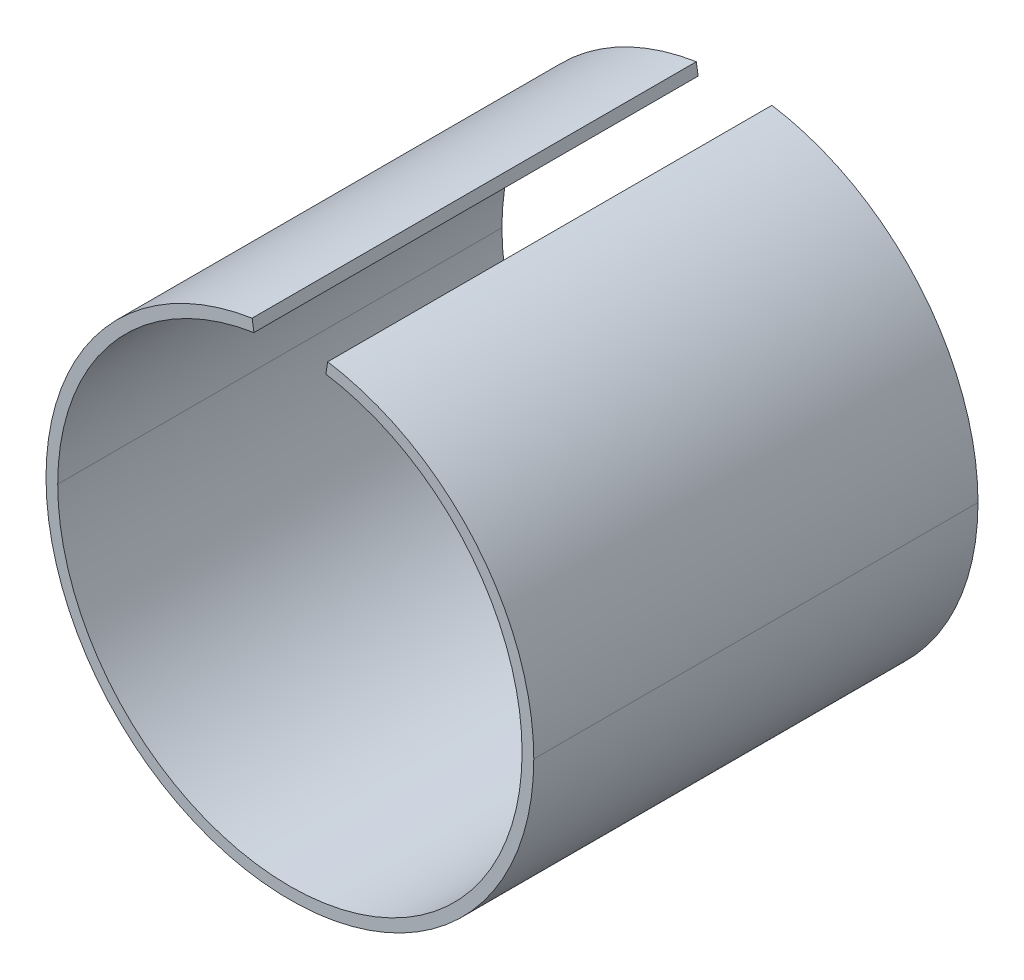
ISO-10303-21;
HEADER;
FILE_DESCRIPTION(('STEP AP214'),'2;1');
FILE_NAME('part.step','',(''),(''),'','','');
FILE_SCHEMA(('AUTOMOTIVE_DESIGN { 1 0 10303 214 1 1 1 1 }'));
ENDSEC;
DATA;
#1=APPLICATION_CONTEXT('core data for automotive mechanical design processes');
#2=APPLICATION_PROTOCOL_DEFINITION('international standard','automotive_design',2000,#1);
#3=PRODUCT_CONTEXT('',#1,'mechanical');
#4=PRODUCT('Part','Part','',(#3));
#5=PRODUCT_RELATED_PRODUCT_CATEGORY('part','',(#4));
#6=PRODUCT_DEFINITION_FORMATION('','',#4);
#7=PRODUCT_DEFINITION_CONTEXT('part definition',#1,'design');
#8=PRODUCT_DEFINITION('design','',#6,#7);
#9=PRODUCT_DEFINITION_SHAPE('','',#8);
#10=(LENGTH_UNIT() NAMED_UNIT(*) SI_UNIT(.MILLI.,.METRE.));
#11=(NAMED_UNIT(*) PLANE_ANGLE_UNIT() SI_UNIT($,.RADIAN.));
#12=(NAMED_UNIT(*) SI_UNIT($,.STERADIAN.) SOLID_ANGLE_UNIT());
#13=UNCERTAINTY_MEASURE_WITH_UNIT(LENGTH_MEASURE(1.E-05),#10,'distance_accuracy_value','');
#14=(GEOMETRIC_REPRESENTATION_CONTEXT(3) GLOBAL_UNCERTAINTY_ASSIGNED_CONTEXT((#13)) GLOBAL_UNIT_ASSIGNED_CONTEXT((#10,
#11,#12)) REPRESENTATION_CONTEXT('',''));
#15=CARTESIAN_POINT('',(0.,0.,0.));
#16=DIRECTION('',(0.,0.,1.));
#17=DIRECTION('',(1.,0.,0.));
#18=AXIS2_PLACEMENT_3D('',#15,#16,#17);
#19=CARTESIAN_POINT('',(0.,0.,34.15));
#20=DIRECTION('',(0.,0.,-1.));
#21=DIRECTION('',(-1.,0.,0.));
#22=AXIS2_PLACEMENT_3D('',#19,#20,#21);
#23=CYLINDRICAL_SURFACE('',#22,17.85);
#24=CARTESIAN_POINT('',(0.,0.,34.15));
#25=DIRECTION('',(0.,0.,1.));
#26=DIRECTION('',(1.,0.,0.));
#27=AXIS2_PLACEMENT_3D('',#24,#25,#26);
#28=CIRCLE('',#27,17.85);
#29=CARTESIAN_POINT('',(-17.85,0.,34.15));
#30=VERTEX_POINT('',#29);
#31=CARTESIAN_POINT('',(17.85,0.,34.15));
#32=VERTEX_POINT('',#31);
#33=EDGE_CURVE('E11',#30,#32,#28,.T.);
#34=ORIENTED_EDGE('',*,*,#33,.T.);
#35=DIRECTION('',(0.,0.,-1.));
#36=VECTOR('',#35,1.);
#37=CARTESIAN_POINT('',(17.85,0.,34.15));
#38=LINE('',#37,#36);
#39=CARTESIAN_POINT('',(17.85,0.,0.));
#40=VERTEX_POINT('',#39);
#41=EDGE_CURVE('E26',#32,#40,#38,.T.);
#42=ORIENTED_EDGE('',*,*,#41,.T.);
#43=CARTESIAN_POINT('',(0.,0.,0.));
#44=DIRECTION('',(0.,0.,1.));
#45=DIRECTION('',(1.,0.,0.));
#46=AXIS2_PLACEMENT_3D('',#43,#44,#45);
#47=CIRCLE('',#46,17.85);
#48=CARTESIAN_POINT('',(-17.85,0.,0.));
#49=VERTEX_POINT('',#48);
#50=EDGE_CURVE('E134',#49,#40,#47,.T.);
#51=ORIENTED_EDGE('',*,*,#50,.F.);
#52=DIRECTION('',(0.,0.,-1.));
#53=VECTOR('',#52,1.);
#54=CARTESIAN_POINT('',(-17.85,0.,34.15));
#55=LINE('',#54,#53);
#56=EDGE_CURVE('E158',#30,#49,#55,.T.);
#57=ORIENTED_EDGE('',*,*,#56,.F.);
#58=EDGE_LOOP('',(#34,#42,#51,#57));
#59=FACE_BOUND('',#58,.T.);
#60=ADVANCED_FACE('F16',(#59),#23,.F.);
#61=CARTESIAN_POINT('',(0.,0.,34.15));
#62=DIRECTION('',(0.,0.,-1.));
#63=DIRECTION('',(-1.,0.,0.));
#64=AXIS2_PLACEMENT_3D('',#61,#62,#63);
#65=CYLINDRICAL_SURFACE('',#64,17.85);
#66=CARTESIAN_POINT('',(0.,0.,34.15));
#67=DIRECTION('',(0.,0.,1.));
#68=DIRECTION('',(1.,0.,0.));
#69=AXIS2_PLACEMENT_3D('',#66,#67,#68);
#70=CIRCLE('',#69,17.85);
#71=CARTESIAN_POINT('',(-2.765,17.634547768514,34.15));
#72=VERTEX_POINT('',#71);
#73=EDGE_CURVE('E196',#72,#30,#70,.T.);
#74=ORIENTED_EDGE('',*,*,#73,.T.);
#75=ORIENTED_EDGE('',*,*,#56,.T.);
#76=CARTESIAN_POINT('',(0.,0.,0.));
#77=DIRECTION('',(0.,0.,1.));
#78=DIRECTION('',(1.,0.,0.));
#79=AXIS2_PLACEMENT_3D('',#76,#77,#78);
#80=CIRCLE('',#79,17.85);
#81=CARTESIAN_POINT('',(-2.765,17.634547768514,0.));
#82=VERTEX_POINT('',#81);
#83=EDGE_CURVE('E93',#82,#49,#80,.T.);
#84=ORIENTED_EDGE('',*,*,#83,.F.);
#85=DIRECTION('',(0.,0.,-1.));
#86=VECTOR('',#85,1.);
#87=CARTESIAN_POINT('',(-2.765,17.634547768514,34.15));
#88=LINE('',#87,#86);
#89=EDGE_CURVE('E84',#72,#82,#88,.T.);
#90=ORIENTED_EDGE('',*,*,#89,.F.);
#91=EDGE_LOOP('',(#74,#75,#84,#90));
#92=FACE_BOUND('',#91,.T.);
#93=ADVANCED_FACE('F283',(#92),#65,.F.);
#94=CARTESIAN_POINT('',(0.,0.,34.15));
#95=DIRECTION('',(0.,0.,-1.));
#96=DIRECTION('',(-1.,0.,0.));
#97=AXIS2_PLACEMENT_3D('',#94,#95,#96);
#98=CYLINDRICAL_SURFACE('',#97,18.75);
#99=CARTESIAN_POINT('',(0.,0.,34.15));
#100=DIRECTION('',(0.,0.,1.));
#101=DIRECTION('',(1.,0.,0.));
#102=AXIS2_PLACEMENT_3D('',#99,#100,#101);
#103=CIRCLE('',#102,18.75);
#104=CARTESIAN_POINT('',(18.75,0.,34.15));
#105=VERTEX_POINT('',#104);
#106=CARTESIAN_POINT('',(2.90441176470588,18.5236846307919,34.15));
#107=VERTEX_POINT('',#106);
#108=EDGE_CURVE('E150',#105,#107,#103,.T.);
#109=ORIENTED_EDGE('',*,*,#108,.F.);
#110=DIRECTION('',(0.,0.,-1.));
#111=VECTOR('',#110,1.);
#112=CARTESIAN_POINT('',(18.75,0.,34.15));
#113=LINE('',#112,#111);
#114=CARTESIAN_POINT('',(18.75,0.,0.));
#115=VERTEX_POINT('',#114);
#116=EDGE_CURVE('E154',#105,#115,#113,.T.);
#117=ORIENTED_EDGE('',*,*,#116,.T.);
#118=CARTESIAN_POINT('',(0.,0.,0.));
#119=DIRECTION('',(0.,0.,1.));
#120=DIRECTION('',(1.,0.,0.));
#121=AXIS2_PLACEMENT_3D('',#118,#119,#120);
#122=CIRCLE('',#121,18.75);
#123=CARTESIAN_POINT('',(2.90441176470588,18.5236846307919,0.));
#124=VERTEX_POINT('',#123);
#125=EDGE_CURVE('E159',#115,#124,#122,.T.);
#126=ORIENTED_EDGE('',*,*,#125,.T.);
#127=DIRECTION('',(0.,0.,-1.));
#128=VECTOR('',#127,1.);
#129=CARTESIAN_POINT('',(2.90441176470588,18.5236846307919,34.15));
#130=LINE('',#129,#128);
#131=EDGE_CURVE('E121',#107,#124,#130,.T.);
#132=ORIENTED_EDGE('',*,*,#131,.F.);
#133=EDGE_LOOP('',(#109,#117,#126,#132));
#134=FACE_BOUND('',#133,.T.);
#135=ADVANCED_FACE('F287',(#134),#98,.T.);
#136=CARTESIAN_POINT('',(0.,0.,34.15));
#137=DIRECTION('',(0.,0.,-1.));
#138=DIRECTION('',(-1.,0.,0.));
#139=AXIS2_PLACEMENT_3D('',#136,#137,#138);
#140=CYLINDRICAL_SURFACE('',#139,18.75);
#141=ORIENTED_EDGE('',*,*,#116,.F.);
#142=CARTESIAN_POINT('',(0.,0.,34.15));
#143=DIRECTION('',(0.,0.,1.));
#144=DIRECTION('',(1.,0.,0.));
#145=AXIS2_PLACEMENT_3D('',#142,#143,#144);
#146=CIRCLE('',#145,18.75);
#147=CARTESIAN_POINT('',(-18.75,0.,34.15));
#148=VERTEX_POINT('',#147);
#149=EDGE_CURVE('E153',#148,#105,#146,.T.);
#150=ORIENTED_EDGE('',*,*,#149,.F.);
#151=DIRECTION('',(0.,0.,-1.));
#152=VECTOR('',#151,1.);
#153=CARTESIAN_POINT('',(-18.75,0.,34.15));
#154=LINE('',#153,#152);
#155=CARTESIAN_POINT('',(-18.75,0.,0.));
#156=VERTEX_POINT('',#155);
#157=EDGE_CURVE('E174',#148,#156,#154,.T.);
#158=ORIENTED_EDGE('',*,*,#157,.T.);
#159=CARTESIAN_POINT('',(0.,0.,0.));
#160=DIRECTION('',(0.,0.,1.));
#161=DIRECTION('',(1.,0.,0.));
#162=AXIS2_PLACEMENT_3D('',#159,#160,#161);
#163=CIRCLE('',#162,18.75);
#164=EDGE_CURVE('E175',#156,#115,#163,.T.);
#165=ORIENTED_EDGE('',*,*,#164,.T.);
#166=EDGE_LOOP('',(#141,#150,#158,#165));
#167=FACE_BOUND('',#166,.T.);
#168=ADVANCED_FACE('F211',(#167),#140,.T.);
#169=CARTESIAN_POINT('',(0.,0.,34.15));
#170=DIRECTION('',(-0.987929846975571,-0.154901960784314,0.));
#171=DIRECTION('',(-0.154901960784314,0.987929846975571,0.));
#172=AXIS2_PLACEMENT_3D('',#169,#170,#171);
#173=PLANE('',#172);
#174=DIRECTION('',(-0.154901960784314,0.987929846975571,0.));
#175=VECTOR('',#174,1.);
#176=CARTESIAN_POINT('',(0.,0.,0.));
#177=LINE('',#176,#175);
#178=CARTESIAN_POINT('',(-2.90441176470588,18.5236846307919,0.));
#179=VERTEX_POINT('',#178);
#180=EDGE_CURVE('E162',#82,#179,#177,.T.);
#181=ORIENTED_EDGE('',*,*,#180,.T.);
#182=DIRECTION('',(0.,0.,-1.));
#183=VECTOR('',#182,1.);
#184=CARTESIAN_POINT('',(-2.90441176470588,18.5236846307919,34.15));
#185=LINE('',#184,#183);
#186=CARTESIAN_POINT('',(-2.90441176470588,18.5236846307919,34.15));
#187=VERTEX_POINT('',#186);
#188=EDGE_CURVE('E144',#187,#179,#185,.T.);
#189=ORIENTED_EDGE('',*,*,#188,.F.);
#190=DIRECTION('',(-0.154901960784314,0.987929846975571,0.));
#191=VECTOR('',#190,1.);
#192=CARTESIAN_POINT('',(0.,0.,34.15));
#193=LINE('',#192,#191);
#194=EDGE_CURVE('E107',#72,#187,#193,.T.);
#195=ORIENTED_EDGE('',*,*,#194,.F.);
#196=ORIENTED_EDGE('',*,*,#89,.T.);
#197=EDGE_LOOP('',(#181,#189,#195,#196));
#198=FACE_BOUND('',#197,.T.);
#199=ADVANCED_FACE('F325',(#198),#173,.F.);
#200=CARTESIAN_POINT('',(0.,0.,34.15));
#201=DIRECTION('',(0.,0.,-1.));
#202=DIRECTION('',(-1.,0.,0.));
#203=AXIS2_PLACEMENT_3D('',#200,#201,#202);
#204=CYLINDRICAL_SURFACE('',#203,18.75);
#205=ORIENTED_EDGE('',*,*,#157,.F.);
#206=CARTESIAN_POINT('',(0.,0.,34.15));
#207=DIRECTION('',(0.,0.,1.));
#208=DIRECTION('',(1.,0.,0.));
#209=AXIS2_PLACEMENT_3D('',#206,#207,#208);
#210=CIRCLE('',#209,18.75);
#211=EDGE_CURVE('E149',#187,#148,#210,.T.);
#212=ORIENTED_EDGE('',*,*,#211,.F.);
#213=ORIENTED_EDGE('',*,*,#188,.T.);
#214=CARTESIAN_POINT('',(0.,0.,0.));
#215=DIRECTION('',(0.,0.,1.));
#216=DIRECTION('',(1.,0.,0.));
#217=AXIS2_PLACEMENT_3D('',#214,#215,#216);
#218=CIRCLE('',#217,18.75);
#219=EDGE_CURVE('E146',#179,#156,#218,.T.);
#220=ORIENTED_EDGE('',*,*,#219,.T.);
#221=EDGE_LOOP('',(#205,#212,#213,#220));
#222=FACE_BOUND('',#221,.T.);
#223=ADVANCED_FACE('F207',(#222),#204,.T.);
#224=CARTESIAN_POINT('',(0.,0.,34.15));
#225=DIRECTION('',(-0.98792984697557,0.154901960784319,0.));
#226=DIRECTION('',(0.,0.,1.));
#227=AXIS2_PLACEMENT_3D('',#224,#225,#226);
#228=PLANE('',#227);
#229=DIRECTION('',(0.154901960784319,0.98792984697557,0.));
#230=VECTOR('',#229,1.);
#231=CARTESIAN_POINT('',(0.,0.,0.));
#232=LINE('',#231,#230);
#233=CARTESIAN_POINT('',(2.765,17.634547768514,0.));
#234=VERTEX_POINT('',#233);
#235=EDGE_CURVE('E19',#234,#124,#232,.T.);
#236=ORIENTED_EDGE('',*,*,#235,.F.);
#237=DIRECTION('',(0.,0.,-1.));
#238=VECTOR('',#237,1.);
#239=CARTESIAN_POINT('',(2.765,17.634547768514,34.15));
#240=LINE('',#239,#238);
#241=CARTESIAN_POINT('',(2.765,17.634547768514,34.15));
#242=VERTEX_POINT('',#241);
#243=EDGE_CURVE('E118',#242,#234,#240,.T.);
#244=ORIENTED_EDGE('',*,*,#243,.F.);
#245=DIRECTION('',(0.154901960784319,0.98792984697557,0.));
#246=VECTOR('',#245,1.);
#247=CARTESIAN_POINT('',(0.,0.,34.15));
#248=LINE('',#247,#246);
#249=EDGE_CURVE('E165',#242,#107,#248,.T.);
#250=ORIENTED_EDGE('',*,*,#249,.T.);
#251=ORIENTED_EDGE('',*,*,#131,.T.);
#252=EDGE_LOOP('',(#236,#244,#250,#251));
#253=FACE_BOUND('',#252,.T.);
#254=ADVANCED_FACE('F116',(#253),#228,.T.);
#255=CARTESIAN_POINT('',(0.,0.,34.15));
#256=DIRECTION('',(0.,0.,-1.));
#257=DIRECTION('',(-1.,0.,0.));
#258=AXIS2_PLACEMENT_3D('',#255,#256,#257);
#259=CYLINDRICAL_SURFACE('',#258,17.85);
#260=ORIENTED_EDGE('',*,*,#41,.F.);
#261=CARTESIAN_POINT('',(0.,0.,34.15));
#262=DIRECTION('',(0.,0.,1.));
#263=DIRECTION('',(1.,0.,0.));
#264=AXIS2_PLACEMENT_3D('',#261,#262,#263);
#265=CIRCLE('',#264,17.85);
#266=EDGE_CURVE('E129',#32,#242,#265,.T.);
#267=ORIENTED_EDGE('',*,*,#266,.T.);
#268=ORIENTED_EDGE('',*,*,#243,.T.);
#269=CARTESIAN_POINT('',(0.,0.,0.));
#270=DIRECTION('',(0.,0.,1.));
#271=DIRECTION('',(1.,0.,0.));
#272=AXIS2_PLACEMENT_3D('',#269,#270,#271);
#273=CIRCLE('',#272,17.85);
#274=EDGE_CURVE('E126',#40,#234,#273,.T.);
#275=ORIENTED_EDGE('',*,*,#274,.F.);
#276=EDGE_LOOP('',(#260,#267,#268,#275));
#277=FACE_BOUND('',#276,.T.);
#278=ADVANCED_FACE('F127',(#277),#259,.F.);
#279=CARTESIAN_POINT('',(0.,0.,34.15));
#280=DIRECTION('',(0.,0.,1.));
#281=DIRECTION('',(1.,0.,0.));
#282=AXIS2_PLACEMENT_3D('',#279,#280,#281);
#283=PLANE('',#282);
#284=ORIENTED_EDGE('',*,*,#194,.T.);
#285=ORIENTED_EDGE('',*,*,#211,.T.);
#286=ORIENTED_EDGE('',*,*,#149,.T.);
#287=ORIENTED_EDGE('',*,*,#108,.T.);
#288=ORIENTED_EDGE('',*,*,#249,.F.);
#289=ORIENTED_EDGE('',*,*,#266,.F.);
#290=ORIENTED_EDGE('',*,*,#33,.F.);
#291=ORIENTED_EDGE('',*,*,#73,.F.);
#292=EDGE_LOOP('',(#284,#285,#286,#287,#288,#289,#290,#291));
#293=FACE_BOUND('',#292,.T.);
#294=ADVANCED_FACE('F292',(#293),#283,.T.);
#295=CARTESIAN_POINT('',(0.,0.,0.));
#296=DIRECTION('',(0.,0.,1.));
#297=DIRECTION('',(1.,0.,0.));
#298=AXIS2_PLACEMENT_3D('',#295,#296,#297);
#299=PLANE('',#298);
#300=ORIENTED_EDGE('',*,*,#180,.F.);
#301=ORIENTED_EDGE('',*,*,#83,.T.);
#302=ORIENTED_EDGE('',*,*,#50,.T.);
#303=ORIENTED_EDGE('',*,*,#274,.T.);
#304=ORIENTED_EDGE('',*,*,#235,.T.);
#305=ORIENTED_EDGE('',*,*,#125,.F.);
#306=ORIENTED_EDGE('',*,*,#164,.F.);
#307=ORIENTED_EDGE('',*,*,#219,.F.);
#308=EDGE_LOOP('',(#300,#301,#302,#303,#304,#305,#306,#307));
#309=FACE_BOUND('',#308,.T.);
#310=ADVANCED_FACE('F133',(#309),#299,.F.);
#311=CLOSED_SHELL('',(#60,#93,#135,#168,#199,#223,#254,#278,#294,#310));
#312=MANIFOLD_SOLID_BREP('B1',#311);
#313=ADVANCED_BREP_SHAPE_REPRESENTATION('',(#18,#312),#14);
#314=SHAPE_DEFINITION_REPRESENTATION(#9,#313);
ENDSEC;
END-ISO-10303-21;
